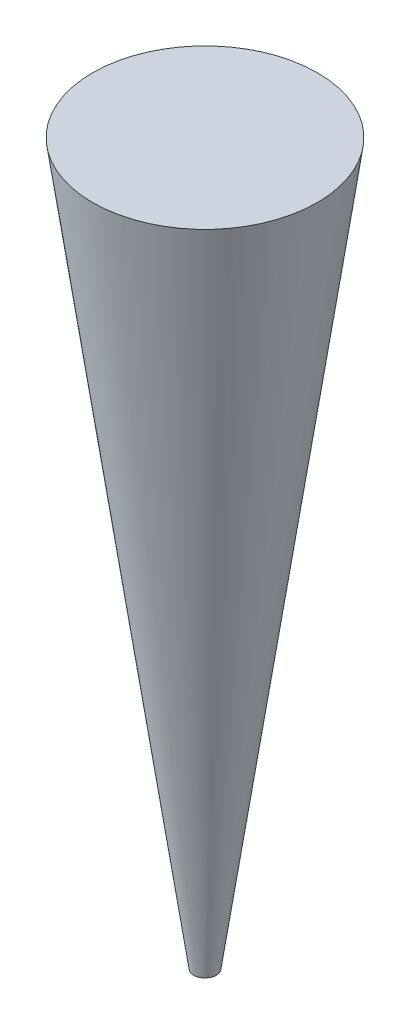
ISO-10303-21;
HEADER;
FILE_DESCRIPTION(('STEP AP214'),'2;1');
FILE_NAME('part.step','',(''),(''),'','','');
FILE_SCHEMA(('AUTOMOTIVE_DESIGN { 1 0 10303 214 1 1 1 1 }'));
ENDSEC;
DATA;
#1=APPLICATION_CONTEXT('core data for automotive mechanical design processes');
#2=APPLICATION_PROTOCOL_DEFINITION('international standard','automotive_design',2000,#1);
#3=PRODUCT_CONTEXT('',#1,'mechanical');
#4=PRODUCT('Part','Part','',(#3));
#5=PRODUCT_RELATED_PRODUCT_CATEGORY('part','',(#4));
#6=PRODUCT_DEFINITION_FORMATION('','',#4);
#7=PRODUCT_DEFINITION_CONTEXT('part definition',#1,'design');
#8=PRODUCT_DEFINITION('design','',#6,#7);
#9=PRODUCT_DEFINITION_SHAPE('','',#8);
#10=(LENGTH_UNIT() NAMED_UNIT(*) SI_UNIT(.MILLI.,.METRE.));
#11=(NAMED_UNIT(*) PLANE_ANGLE_UNIT() SI_UNIT($,.RADIAN.));
#12=(NAMED_UNIT(*) SI_UNIT($,.STERADIAN.) SOLID_ANGLE_UNIT());
#13=UNCERTAINTY_MEASURE_WITH_UNIT(LENGTH_MEASURE(1.E-05),#10,'distance_accuracy_value','');
#14=(GEOMETRIC_REPRESENTATION_CONTEXT(3) GLOBAL_UNCERTAINTY_ASSIGNED_CONTEXT((#13)) GLOBAL_UNIT_ASSIGNED_CONTEXT((#10,
#11,#12)) REPRESENTATION_CONTEXT('',''));
#15=CARTESIAN_POINT('',(0.,0.,0.));
#16=DIRECTION('',(0.,0.,1.));
#17=DIRECTION('',(1.,0.,0.));
#18=AXIS2_PLACEMENT_3D('',#15,#16,#17);
#19=CARTESIAN_POINT('',(0.,0.,0.));
#20=DIRECTION('',(0.,1.,0.));
#21=DIRECTION('',(0.,0.,1.));
#22=AXIS2_PLACEMENT_3D('',#19,#20,#21);
#23=CONICAL_SURFACE('',#22,0.,0.139626340159547);
#24=CARTESIAN_POINT('',(0.,30.,0.));
#25=DIRECTION('',(0.,1.,0.));
#26=DIRECTION('',(0.,0.,1.));
#27=AXIS2_PLACEMENT_3D('',#24,#25,#26);
#28=CIRCLE('',#27,4.21622504107175);
#29=CARTESIAN_POINT('',(0.,30.,4.21622504107175));
#30=VERTEX_POINT('',#29);
#31=EDGE_CURVE('E36',#30,#30,#28,.F.);
#32=CARTESIAN_POINT('',(0.,300.,0.));
#33=DIRECTION('',(0.,-1.,0.));
#34=DIRECTION('',(0.,0.,-1.));
#35=AXIS2_PLACEMENT_3D('',#32,#33,#34);
#36=CIRCLE('',#35,42.1622504107175);
#37=CARTESIAN_POINT('',(0.,300.,42.1622504107175));
#38=VERTEX_POINT('',#37);
#39=EDGE_CURVE('E10',#38,#38,#36,.T.);
#40=CARTESIAN_POINT('',(0.,30.,4.21622504107175));
#41=CARTESIAN_POINT('',(0.,32.8125,4.61149613867223));
#42=CARTESIAN_POINT('',(0.,35.625,5.00676723627271));
#43=CARTESIAN_POINT('',(0.,41.25,5.79730943147366));
#44=CARTESIAN_POINT('',(0.,44.0625,6.19258052907414));
#45=CARTESIAN_POINT('',(0.,49.6875,6.98312272427509));
#46=CARTESIAN_POINT('',(0.,52.5,7.37839382187557));
#47=CARTESIAN_POINT('',(0.,58.125,8.16893601707652));
#48=CARTESIAN_POINT('',(0.,60.9375,8.564207114677));
#49=CARTESIAN_POINT('',(0.,66.5625,9.35474930987795));
#50=CARTESIAN_POINT('',(0.,69.375,9.75002040747843));
#51=CARTESIAN_POINT('',(0.,75.,10.5405626026794));
#52=CARTESIAN_POINT('',(0.,77.8125,10.9358337002799));
#53=CARTESIAN_POINT('',(0.,83.4375,11.7263758954808));
#54=CARTESIAN_POINT('',(0.,86.25,12.1216469930813));
#55=CARTESIAN_POINT('',(0.,91.875,12.9121891882822));
#56=CARTESIAN_POINT('',(0.,94.6875,13.3074602858827));
#57=CARTESIAN_POINT('',(0.,100.3125,14.0980024810837));
#58=CARTESIAN_POINT('',(0.,103.125,14.4932735786841));
#59=CARTESIAN_POINT('',(0.,108.75,15.2838157738851));
#60=CARTESIAN_POINT('',(0.,111.5625,15.6790868714856));
#61=CARTESIAN_POINT('',(0.,117.1875,16.4696290666865));
#62=CARTESIAN_POINT('',(0.,120.,16.864900164287));
#63=CARTESIAN_POINT('',(0.,125.625,17.655442359488));
#64=CARTESIAN_POINT('',(0.,128.4375,18.0507134570884));
#65=CARTESIAN_POINT('',(0.,134.0625,18.8412556522894));
#66=CARTESIAN_POINT('',(0.,136.875,19.2365267498899));
#67=CARTESIAN_POINT('',(0.,142.5,20.0270689450908));
#68=CARTESIAN_POINT('',(0.,145.3125,20.4223400426913));
#69=CARTESIAN_POINT('',(0.,150.9375,21.2128822378922));
#70=CARTESIAN_POINT('',(0.,153.75,21.6081533354927));
#71=CARTESIAN_POINT('',(0.,159.375,22.3986955306937));
#72=CARTESIAN_POINT('',(0.,162.1875,22.7939666282942));
#73=CARTESIAN_POINT('',(0.,167.8125,23.5845088234951));
#74=CARTESIAN_POINT('',(0.,170.625,23.9797799210956));
#75=CARTESIAN_POINT('',(0.,176.25,24.7703221162965));
#76=CARTESIAN_POINT('',(0.,179.0625,25.165593213897));
#77=CARTESIAN_POINT('',(0.,184.6875,25.956135409098));
#78=CARTESIAN_POINT('',(0.,187.5,26.3514065066985));
#79=CARTESIAN_POINT('',(0.,193.125,27.1419487018994));
#80=CARTESIAN_POINT('',(0.,195.9375,27.5372197994999));
#81=CARTESIAN_POINT('',(0.,201.5625,28.3277619947008));
#82=CARTESIAN_POINT('',(0.,204.375,28.7230330923013));
#83=CARTESIAN_POINT('',(0.,210.,29.5135752875023));
#84=CARTESIAN_POINT('',(0.,212.8125,29.9088463851027));
#85=CARTESIAN_POINT('',(0.,218.4375,30.6993885803037));
#86=CARTESIAN_POINT('',(0.,221.25,31.0946596779042));
#87=CARTESIAN_POINT('',(0.,226.875,31.8852018731051));
#88=CARTESIAN_POINT('',(0.,229.6875,32.2804729707056));
#89=CARTESIAN_POINT('',(0.,235.3125,33.0710151659066));
#90=CARTESIAN_POINT('',(0.,238.125,33.466286263507));
#91=CARTESIAN_POINT('',(0.,243.75,34.256828458708));
#92=CARTESIAN_POINT('',(0.,246.5625,34.6520995563085));
#93=CARTESIAN_POINT('',(0.,252.1875,35.4426417515094));
#94=CARTESIAN_POINT('',(0.,255.,35.8379128491099));
#95=CARTESIAN_POINT('',(0.,260.625,36.6284550443108));
#96=CARTESIAN_POINT('',(0.,263.4375,37.0237261419113));
#97=CARTESIAN_POINT('',(0.,269.0625,37.8142683371123));
#98=CARTESIAN_POINT('',(0.,271.875,38.2095394347127));
#99=CARTESIAN_POINT('',(0.,277.5,39.0000816299137));
#100=CARTESIAN_POINT('',(0.,280.3125,39.3953527275142));
#101=CARTESIAN_POINT('',(0.,285.9375,40.1858949227151));
#102=CARTESIAN_POINT('',(0.,288.75,40.5811660203156));
#103=CARTESIAN_POINT('',(0.,294.375,41.3717082155166));
#104=CARTESIAN_POINT('',(0.,297.1875,41.766979313117));
#105=CARTESIAN_POINT('',(0.,300.,42.1622504107175));
#106=B_SPLINE_CURVE_WITH_KNOTS('',3,(#40,#41,#42,#43,#44,#45,#46,#47,#48,#49,#50,#51,#52,#53,
#54,#55,#56,#57,#58,#59,#60,#61,#62,#63,#64,#65,#66,#67,#68,#69,#70,#71,#72,#73,#74,#75,#76,#77,
#78,#79,#80,#81,#82,#83,#84,#85,#86,#87,#88,#89,#90,#91,#92,#93,#94,#95,#96,#97,#98,#99,#100,
#101,#102,#103,#104,#105),.UNSPECIFIED.,.F.,.F.,(4,2,2,2,2,2,2,2,2,2,2,2,2,2,2,2,2,2,2,2,2,2,2,
2,2,2,2,2,2,2,2,2,4),(0.,8.52042014312584,17.0408402862517,25.5612604293775,34.0816805725034,
42.6021007156292,51.1225208587551,59.6429410018809,68.1633611450067,76.6837812881326,
85.2042014312584,93.7246215743843,102.24504171751,110.765461860636,119.285882003762,
127.806302146888,136.326722290013,144.847142433139,153.367562576265,161.887982719391,
170.408402862517,178.928823005643,187.449243148768,195.969663291894,204.49008343502,
213.010503578146,221.530923721272,230.051343864398,238.571764007523,247.092184150649,
255.612604293775,264.133024436901,272.653444580027),.UNSPECIFIED.);
#107=EDGE_CURVE('BSEAM33',#30,#38,#106,.T.);
#108=ORIENTED_EDGE('',*,*,#31,.F.);
#109=ORIENTED_EDGE('',*,*,#39,.T.);
#110=ORIENTED_EDGE('',*,*,#107,.T.);
#111=ORIENTED_EDGE('',*,*,#107,.F.);
#112=EDGE_LOOP('',(#108,#110,#109,#111));
#113=FACE_BOUND('',#112,.T.);
#114=ADVANCED_FACE('F33',(#113),#23,.T.);
#115=CARTESIAN_POINT('',(42.1622504107175,300.,0.));
#116=DIRECTION('',(0.,1.,0.));
#117=DIRECTION('',(0.,0.,1.));
#118=AXIS2_PLACEMENT_3D('',#115,#116,#117);
#119=PLANE('',#118);
#120=ORIENTED_EDGE('',*,*,#39,.F.);
#121=EDGE_LOOP('',(#120));
#122=FACE_BOUND('',#121,.T.);
#123=ADVANCED_FACE('F48',(#122),#119,.T.);
#124=CARTESIAN_POINT('',(-10.1498326880889,30.,-42.1622504107175));
#125=DIRECTION('',(0.,1.,0.));
#126=DIRECTION('',(0.,0.,1.));
#127=AXIS2_PLACEMENT_3D('',#124,#125,#126);
#128=PLANE('',#127);
#129=ORIENTED_EDGE('',*,*,#31,.T.);
#130=EDGE_LOOP('',(#129));
#131=FACE_BOUND('',#130,.T.);
#132=ADVANCED_FACE('F45',(#131),#128,.F.);
#133=CLOSED_SHELL('',(#114,#123,#132));
#134=MANIFOLD_SOLID_BREP('B2',#133);
#135=ADVANCED_BREP_SHAPE_REPRESENTATION('',(#18,#134),#14);
#136=SHAPE_DEFINITION_REPRESENTATION(#9,#135);
ENDSEC;
END-ISO-10303-21;
